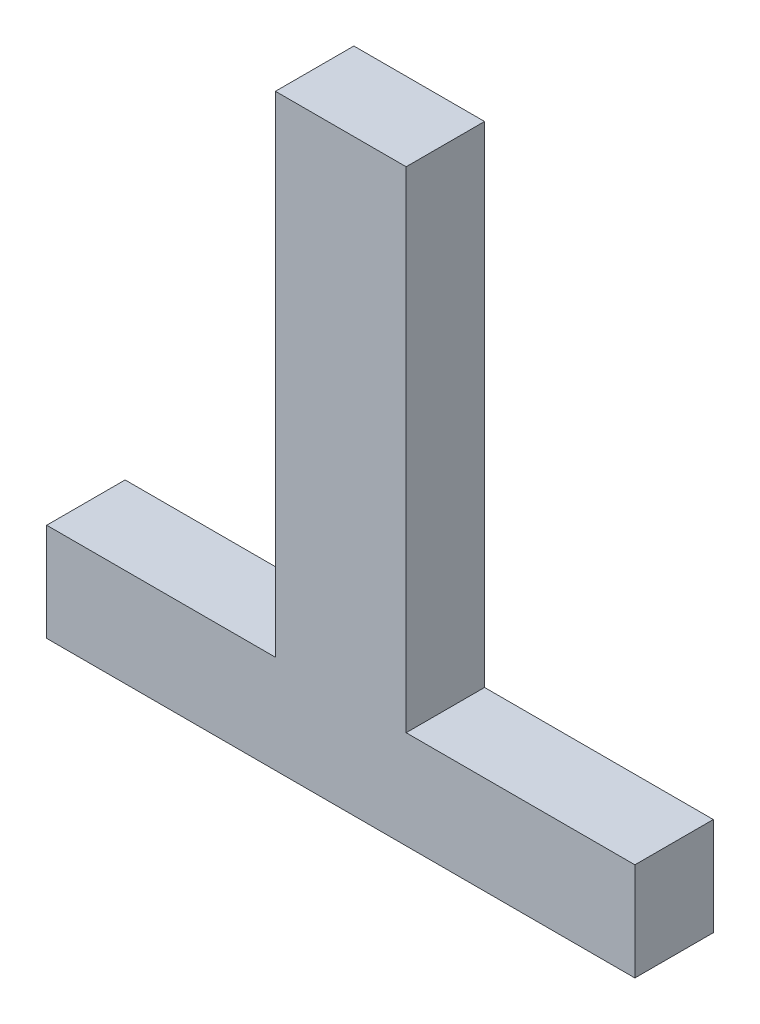
ISO-10303-21;
HEADER;
FILE_DESCRIPTION(('STEP AP214'),'2;1');
FILE_NAME('part.step','',(''),(''),'','','');
FILE_SCHEMA(('AUTOMOTIVE_DESIGN { 1 0 10303 214 1 1 1 1 }'));
ENDSEC;
DATA;
#1=APPLICATION_CONTEXT('core data for automotive mechanical design processes');
#2=APPLICATION_PROTOCOL_DEFINITION('international standard','automotive_design',2000,#1);
#3=PRODUCT_CONTEXT('',#1,'mechanical');
#4=PRODUCT('Part','Part','',(#3));
#5=PRODUCT_RELATED_PRODUCT_CATEGORY('part','',(#4));
#6=PRODUCT_DEFINITION_FORMATION('','',#4);
#7=PRODUCT_DEFINITION_CONTEXT('part definition',#1,'design');
#8=PRODUCT_DEFINITION('design','',#6,#7);
#9=PRODUCT_DEFINITION_SHAPE('','',#8);
#10=(LENGTH_UNIT() NAMED_UNIT(*) SI_UNIT(.MILLI.,.METRE.));
#11=(NAMED_UNIT(*) PLANE_ANGLE_UNIT() SI_UNIT($,.RADIAN.));
#12=(NAMED_UNIT(*) SI_UNIT($,.STERADIAN.) SOLID_ANGLE_UNIT());
#13=UNCERTAINTY_MEASURE_WITH_UNIT(LENGTH_MEASURE(1.E-05),#10,'distance_accuracy_value','');
#14=(GEOMETRIC_REPRESENTATION_CONTEXT(3) GLOBAL_UNCERTAINTY_ASSIGNED_CONTEXT((#13)) GLOBAL_UNIT_ASSIGNED_CONTEXT((#10,
#11,#12)) REPRESENTATION_CONTEXT('',''));
#15=CARTESIAN_POINT('',(0.,0.,0.));
#16=DIRECTION('',(0.,0.,1.));
#17=DIRECTION('',(1.,0.,0.));
#18=AXIS2_PLACEMENT_3D('',#15,#16,#17);
#19=CARTESIAN_POINT('',(-45.,15.,12.));
#20=DIRECTION('',(1.,0.,0.));
#21=DIRECTION('',(0.,0.,-1.));
#22=AXIS2_PLACEMENT_3D('',#19,#20,#21);
#23=PLANE('',#22);
#24=DIRECTION('',(0.,-1.,0.));
#25=VECTOR('',#24,1.);
#26=CARTESIAN_POINT('',(-45.,15.,0.));
#27=LINE('',#26,#25);
#28=CARTESIAN_POINT('',(-45.,15.,0.));
#29=VERTEX_POINT('',#28);
#30=CARTESIAN_POINT('',(-45.,0.,0.));
#31=VERTEX_POINT('',#30);
#32=EDGE_CURVE('E137',#29,#31,#27,.T.);
#33=ORIENTED_EDGE('',*,*,#32,.T.);
#34=DIRECTION('',(0.,0.,-1.));
#35=VECTOR('',#34,1.);
#36=CARTESIAN_POINT('',(-45.,0.,12.));
#37=LINE('',#36,#35);
#38=CARTESIAN_POINT('',(-45.,0.,12.));
#39=VERTEX_POINT('',#38);
#40=EDGE_CURVE('E11',#39,#31,#37,.T.);
#41=ORIENTED_EDGE('',*,*,#40,.F.);
#42=DIRECTION('',(0.,-1.,0.));
#43=VECTOR('',#42,1.);
#44=CARTESIAN_POINT('',(-45.,15.,12.));
#45=LINE('',#44,#43);
#46=CARTESIAN_POINT('',(-45.,15.,12.));
#47=VERTEX_POINT('',#46);
#48=EDGE_CURVE('E151',#47,#39,#45,.T.);
#49=ORIENTED_EDGE('',*,*,#48,.F.);
#50=DIRECTION('',(0.,0.,-1.));
#51=VECTOR('',#50,1.);
#52=CARTESIAN_POINT('',(-45.,15.,12.));
#53=LINE('',#52,#51);
#54=EDGE_CURVE('E133',#47,#29,#53,.T.);
#55=ORIENTED_EDGE('',*,*,#54,.T.);
#56=EDGE_LOOP('',(#33,#41,#49,#55));
#57=FACE_BOUND('',#56,.T.);
#58=ADVANCED_FACE('F41',(#57),#23,.F.);
#59=CARTESIAN_POINT('',(-45.,0.,12.));
#60=DIRECTION('',(0.,1.,0.));
#61=DIRECTION('',(0.,0.,1.));
#62=AXIS2_PLACEMENT_3D('',#59,#60,#61);
#63=PLANE('',#62);
#64=DIRECTION('',(1.,0.,0.));
#65=VECTOR('',#64,1.);
#66=CARTESIAN_POINT('',(-45.,0.,0.));
#67=LINE('',#66,#65);
#68=CARTESIAN_POINT('',(45.,0.,0.));
#69=VERTEX_POINT('',#68);
#70=EDGE_CURVE('E140',#31,#69,#67,.T.);
#71=ORIENTED_EDGE('',*,*,#70,.T.);
#72=DIRECTION('',(0.,0.,-1.));
#73=VECTOR('',#72,1.);
#74=CARTESIAN_POINT('',(45.,0.,12.));
#75=LINE('',#74,#73);
#76=CARTESIAN_POINT('',(45.,0.,12.));
#77=VERTEX_POINT('',#76);
#78=EDGE_CURVE('E49',#77,#69,#75,.T.);
#79=ORIENTED_EDGE('',*,*,#78,.F.);
#80=DIRECTION('',(1.,0.,0.));
#81=VECTOR('',#80,1.);
#82=CARTESIAN_POINT('',(-45.,0.,12.));
#83=LINE('',#82,#81);
#84=EDGE_CURVE('E100',#39,#77,#83,.T.);
#85=ORIENTED_EDGE('',*,*,#84,.F.);
#86=ORIENTED_EDGE('',*,*,#40,.T.);
#87=EDGE_LOOP('',(#71,#79,#85,#86));
#88=FACE_BOUND('',#87,.T.);
#89=ADVANCED_FACE('F186',(#88),#63,.F.);
#90=CARTESIAN_POINT('',(45.,0.,12.));
#91=DIRECTION('',(-1.,0.,0.));
#92=DIRECTION('',(0.,0.,1.));
#93=AXIS2_PLACEMENT_3D('',#90,#91,#92);
#94=PLANE('',#93);
#95=DIRECTION('',(0.,1.,0.));
#96=VECTOR('',#95,1.);
#97=CARTESIAN_POINT('',(45.,0.,0.));
#98=LINE('',#97,#96);
#99=CARTESIAN_POINT('',(45.,15.,0.));
#100=VERTEX_POINT('',#99);
#101=EDGE_CURVE('E142',#69,#100,#98,.T.);
#102=ORIENTED_EDGE('',*,*,#101,.T.);
#103=DIRECTION('',(0.,0.,-1.));
#104=VECTOR('',#103,1.);
#105=CARTESIAN_POINT('',(45.,15.,12.));
#106=LINE('',#105,#104);
#107=CARTESIAN_POINT('',(45.,15.,12.));
#108=VERTEX_POINT('',#107);
#109=EDGE_CURVE('E158',#108,#100,#106,.T.);
#110=ORIENTED_EDGE('',*,*,#109,.F.);
#111=DIRECTION('',(0.,1.,0.));
#112=VECTOR('',#111,1.);
#113=CARTESIAN_POINT('',(45.,0.,12.));
#114=LINE('',#113,#112);
#115=EDGE_CURVE('E166',#77,#108,#114,.T.);
#116=ORIENTED_EDGE('',*,*,#115,.F.);
#117=ORIENTED_EDGE('',*,*,#78,.T.);
#118=EDGE_LOOP('',(#102,#110,#116,#117));
#119=FACE_BOUND('',#118,.T.);
#120=ADVANCED_FACE('F164',(#119),#94,.F.);
#121=CARTESIAN_POINT('',(45.,15.,12.));
#122=DIRECTION('',(0.,-1.,0.));
#123=DIRECTION('',(0.,0.,-1.));
#124=AXIS2_PLACEMENT_3D('',#121,#122,#123);
#125=PLANE('',#124);
#126=DIRECTION('',(-1.,0.,0.));
#127=VECTOR('',#126,1.);
#128=CARTESIAN_POINT('',(45.,15.,0.));
#129=LINE('',#128,#127);
#130=CARTESIAN_POINT('',(10.,15.,0.));
#131=VERTEX_POINT('',#130);
#132=EDGE_CURVE('E144',#100,#131,#129,.T.);
#133=ORIENTED_EDGE('',*,*,#132,.T.);
#134=DIRECTION('',(0.,0.,-1.));
#135=VECTOR('',#134,1.);
#136=CARTESIAN_POINT('',(10.,15.,12.));
#137=LINE('',#136,#135);
#138=CARTESIAN_POINT('',(10.,15.,12.));
#139=VERTEX_POINT('',#138);
#140=EDGE_CURVE('E155',#139,#131,#137,.T.);
#141=ORIENTED_EDGE('',*,*,#140,.F.);
#142=DIRECTION('',(-1.,0.,0.));
#143=VECTOR('',#142,1.);
#144=CARTESIAN_POINT('',(45.,15.,12.));
#145=LINE('',#144,#143);
#146=EDGE_CURVE('E178',#108,#139,#145,.T.);
#147=ORIENTED_EDGE('',*,*,#146,.F.);
#148=ORIENTED_EDGE('',*,*,#109,.T.);
#149=EDGE_LOOP('',(#133,#141,#147,#148));
#150=FACE_BOUND('',#149,.T.);
#151=ADVANCED_FACE('F174',(#150),#125,.F.);
#152=CARTESIAN_POINT('',(10.,15.,12.));
#153=DIRECTION('',(-1.,0.,0.));
#154=DIRECTION('',(0.,0.,1.));
#155=AXIS2_PLACEMENT_3D('',#152,#153,#154);
#156=PLANE('',#155);
#157=DIRECTION('',(0.,1.,0.));
#158=VECTOR('',#157,1.);
#159=CARTESIAN_POINT('',(10.,15.,0.));
#160=LINE('',#159,#158);
#161=CARTESIAN_POINT('',(10.,90.,0.));
#162=VERTEX_POINT('',#161);
#163=EDGE_CURVE('E146',#131,#162,#160,.T.);
#164=ORIENTED_EDGE('',*,*,#163,.T.);
#165=DIRECTION('',(0.,0.,-1.));
#166=VECTOR('',#165,1.);
#167=CARTESIAN_POINT('',(10.,90.,12.));
#168=LINE('',#167,#166);
#169=CARTESIAN_POINT('',(10.,90.,12.));
#170=VERTEX_POINT('',#169);
#171=EDGE_CURVE('E128',#170,#162,#168,.T.);
#172=ORIENTED_EDGE('',*,*,#171,.F.);
#173=DIRECTION('',(0.,1.,0.));
#174=VECTOR('',#173,1.);
#175=CARTESIAN_POINT('',(10.,15.,12.));
#176=LINE('',#175,#174);
#177=EDGE_CURVE('E119',#139,#170,#176,.T.);
#178=ORIENTED_EDGE('',*,*,#177,.F.);
#179=ORIENTED_EDGE('',*,*,#140,.T.);
#180=EDGE_LOOP('',(#164,#172,#178,#179));
#181=FACE_BOUND('',#180,.T.);
#182=ADVANCED_FACE('F177',(#181),#156,.F.);
#183=CARTESIAN_POINT('',(10.,90.,12.));
#184=DIRECTION('',(0.,-1.,0.));
#185=DIRECTION('',(0.,0.,-1.));
#186=AXIS2_PLACEMENT_3D('',#183,#184,#185);
#187=PLANE('',#186);
#188=DIRECTION('',(-1.,0.,0.));
#189=VECTOR('',#188,1.);
#190=CARTESIAN_POINT('',(10.,90.,0.));
#191=LINE('',#190,#189);
#192=CARTESIAN_POINT('',(-10.,90.,0.));
#193=VERTEX_POINT('',#192);
#194=EDGE_CURVE('E127',#162,#193,#191,.T.);
#195=ORIENTED_EDGE('',*,*,#194,.T.);
#196=DIRECTION('',(0.,0.,-1.));
#197=VECTOR('',#196,1.);
#198=CARTESIAN_POINT('',(-10.,90.,12.));
#199=LINE('',#198,#197);
#200=CARTESIAN_POINT('',(-10.,90.,12.));
#201=VERTEX_POINT('',#200);
#202=EDGE_CURVE('E124',#201,#193,#199,.T.);
#203=ORIENTED_EDGE('',*,*,#202,.F.);
#204=DIRECTION('',(-1.,0.,0.));
#205=VECTOR('',#204,1.);
#206=CARTESIAN_POINT('',(10.,90.,12.));
#207=LINE('',#206,#205);
#208=EDGE_CURVE('E113',#170,#201,#207,.T.);
#209=ORIENTED_EDGE('',*,*,#208,.F.);
#210=ORIENTED_EDGE('',*,*,#171,.T.);
#211=EDGE_LOOP('',(#195,#203,#209,#210));
#212=FACE_BOUND('',#211,.T.);
#213=ADVANCED_FACE('F125',(#212),#187,.F.);
#214=CARTESIAN_POINT('',(-10.,90.,12.));
#215=DIRECTION('',(1.,0.,0.));
#216=DIRECTION('',(0.,0.,-1.));
#217=AXIS2_PLACEMENT_3D('',#214,#215,#216);
#218=PLANE('',#217);
#219=DIRECTION('',(0.,-1.,0.));
#220=VECTOR('',#219,1.);
#221=CARTESIAN_POINT('',(-10.,90.,0.));
#222=LINE('',#221,#220);
#223=CARTESIAN_POINT('',(-10.,15.,0.));
#224=VERTEX_POINT('',#223);
#225=EDGE_CURVE('E86',#193,#224,#222,.T.);
#226=ORIENTED_EDGE('',*,*,#225,.T.);
#227=DIRECTION('',(0.,0.,-1.));
#228=VECTOR('',#227,1.);
#229=CARTESIAN_POINT('',(-10.,15.,12.));
#230=LINE('',#229,#228);
#231=CARTESIAN_POINT('',(-10.,15.,12.));
#232=VERTEX_POINT('',#231);
#233=EDGE_CURVE('E129',#232,#224,#230,.T.);
#234=ORIENTED_EDGE('',*,*,#233,.F.);
#235=DIRECTION('',(0.,-1.,0.));
#236=VECTOR('',#235,1.);
#237=CARTESIAN_POINT('',(-10.,90.,12.));
#238=LINE('',#237,#236);
#239=EDGE_CURVE('E117',#201,#232,#238,.T.);
#240=ORIENTED_EDGE('',*,*,#239,.F.);
#241=ORIENTED_EDGE('',*,*,#202,.T.);
#242=EDGE_LOOP('',(#226,#234,#240,#241));
#243=FACE_BOUND('',#242,.T.);
#244=ADVANCED_FACE('F131',(#243),#218,.F.);
#245=CARTESIAN_POINT('',(-10.,15.,12.));
#246=DIRECTION('',(0.,-1.,0.));
#247=DIRECTION('',(0.,0.,-1.));
#248=AXIS2_PLACEMENT_3D('',#245,#246,#247);
#249=PLANE('',#248);
#250=DIRECTION('',(-1.,0.,0.));
#251=VECTOR('',#250,1.);
#252=CARTESIAN_POINT('',(-10.,15.,0.));
#253=LINE('',#252,#251);
#254=EDGE_CURVE('E92',#224,#29,#253,.T.);
#255=ORIENTED_EDGE('',*,*,#254,.T.);
#256=ORIENTED_EDGE('',*,*,#54,.F.);
#257=DIRECTION('',(-1.,0.,0.));
#258=VECTOR('',#257,1.);
#259=CARTESIAN_POINT('',(-10.,15.,12.));
#260=LINE('',#259,#258);
#261=EDGE_CURVE('E57',#232,#47,#260,.T.);
#262=ORIENTED_EDGE('',*,*,#261,.F.);
#263=ORIENTED_EDGE('',*,*,#233,.T.);
#264=EDGE_LOOP('',(#255,#256,#262,#263));
#265=FACE_BOUND('',#264,.T.);
#266=ADVANCED_FACE('F202',(#265),#249,.F.);
#267=CARTESIAN_POINT('',(0.,0.,12.));
#268=DIRECTION('',(0.,0.,1.));
#269=DIRECTION('',(1.,0.,0.));
#270=AXIS2_PLACEMENT_3D('',#267,#268,#269);
#271=PLANE('',#270);
#272=ORIENTED_EDGE('',*,*,#48,.T.);
#273=ORIENTED_EDGE('',*,*,#84,.T.);
#274=ORIENTED_EDGE('',*,*,#115,.T.);
#275=ORIENTED_EDGE('',*,*,#146,.T.);
#276=ORIENTED_EDGE('',*,*,#177,.T.);
#277=ORIENTED_EDGE('',*,*,#208,.T.);
#278=ORIENTED_EDGE('',*,*,#239,.T.);
#279=ORIENTED_EDGE('',*,*,#261,.T.);
#280=EDGE_LOOP('',(#272,#273,#274,#275,#276,#277,#278,#279));
#281=FACE_BOUND('',#280,.T.);
#282=ADVANCED_FACE('F115',(#281),#271,.T.);
#283=CARTESIAN_POINT('',(0.,0.,0.));
#284=DIRECTION('',(0.,0.,1.));
#285=DIRECTION('',(1.,0.,0.));
#286=AXIS2_PLACEMENT_3D('',#283,#284,#285);
#287=PLANE('',#286);
#288=ORIENTED_EDGE('',*,*,#32,.F.);
#289=ORIENTED_EDGE('',*,*,#254,.F.);
#290=ORIENTED_EDGE('',*,*,#225,.F.);
#291=ORIENTED_EDGE('',*,*,#194,.F.);
#292=ORIENTED_EDGE('',*,*,#163,.F.);
#293=ORIENTED_EDGE('',*,*,#132,.F.);
#294=ORIENTED_EDGE('',*,*,#101,.F.);
#295=ORIENTED_EDGE('',*,*,#70,.F.);
#296=EDGE_LOOP('',(#288,#289,#290,#291,#292,#293,#294,#295));
#297=FACE_BOUND('',#296,.T.);
#298=ADVANCED_FACE('F170',(#297),#287,.F.);
#299=CLOSED_SHELL('',(#58,#89,#120,#151,#182,#213,#244,#266,#282,#298));
#300=MANIFOLD_SOLID_BREP('B2',#299);
#301=ADVANCED_BREP_SHAPE_REPRESENTATION('',(#18,#300),#14);
#302=SHAPE_DEFINITION_REPRESENTATION(#9,#301);
ENDSEC;
END-ISO-10303-21;
